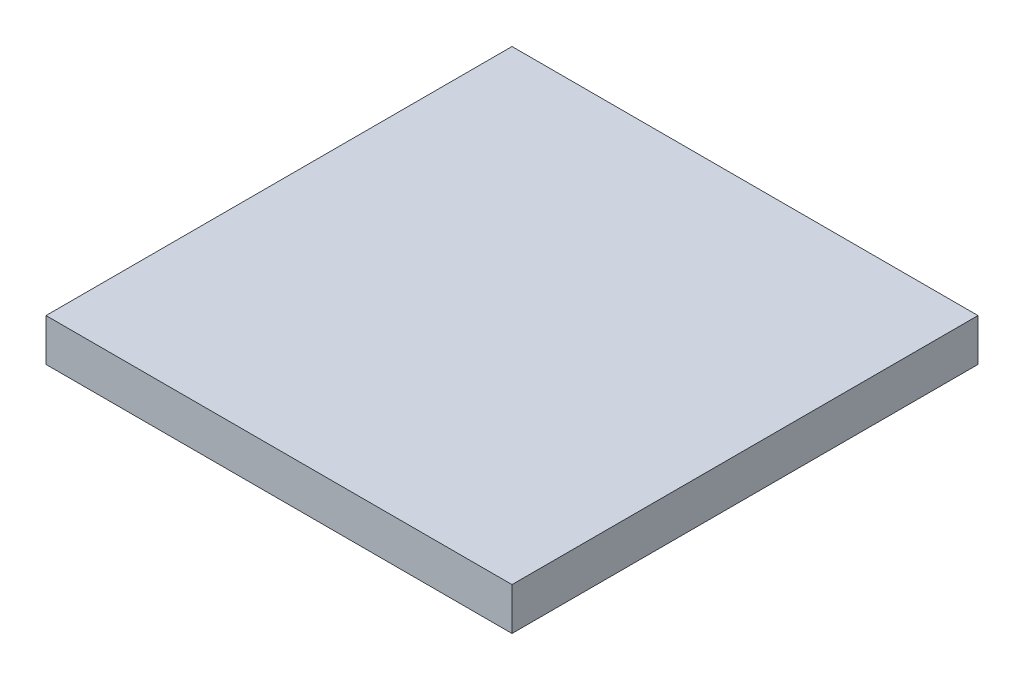
ISO-10303-21;
HEADER;
FILE_DESCRIPTION(('STEP AP214'),'2;1');
FILE_NAME('part.step','',(''),(''),'','','');
FILE_SCHEMA(('AUTOMOTIVE_DESIGN { 1 0 10303 214 1 1 1 1 }'));
ENDSEC;
DATA;
#1=APPLICATION_CONTEXT('core data for automotive mechanical design processes');
#2=APPLICATION_PROTOCOL_DEFINITION('international standard','automotive_design',2000,#1);
#3=PRODUCT_CONTEXT('',#1,'mechanical');
#4=PRODUCT('Part','Part','',(#3));
#5=PRODUCT_RELATED_PRODUCT_CATEGORY('part','',(#4));
#6=PRODUCT_DEFINITION_FORMATION('','',#4);
#7=PRODUCT_DEFINITION_CONTEXT('part definition',#1,'design');
#8=PRODUCT_DEFINITION('design','',#6,#7);
#9=PRODUCT_DEFINITION_SHAPE('','',#8);
#10=(LENGTH_UNIT() NAMED_UNIT(*) SI_UNIT(.MILLI.,.METRE.));
#11=(NAMED_UNIT(*) PLANE_ANGLE_UNIT() SI_UNIT($,.RADIAN.));
#12=(NAMED_UNIT(*) SI_UNIT($,.STERADIAN.) SOLID_ANGLE_UNIT());
#13=UNCERTAINTY_MEASURE_WITH_UNIT(LENGTH_MEASURE(1.E-05),#10,'distance_accuracy_value','');
#14=(GEOMETRIC_REPRESENTATION_CONTEXT(3) GLOBAL_UNCERTAINTY_ASSIGNED_CONTEXT((#13)) GLOBAL_UNIT_ASSIGNED_CONTEXT((#10,
#11,#12)) REPRESENTATION_CONTEXT('',''));
#15=CARTESIAN_POINT('',(0.,0.,0.));
#16=DIRECTION('',(0.,0.,1.));
#17=DIRECTION('',(1.,0.,0.));
#18=AXIS2_PLACEMENT_3D('',#15,#16,#17);
#19=CARTESIAN_POINT('',(55.,5.,0.));
#20=DIRECTION('',(0.,0.,-1.));
#21=DIRECTION('',(-1.,0.,0.));
#22=AXIS2_PLACEMENT_3D('',#19,#20,#21);
#23=PLANE('',#22);
#24=DIRECTION('',(1.,0.,0.));
#25=VECTOR('',#24,1.);
#26=CARTESIAN_POINT('',(55.,0.,0.));
#27=LINE('',#26,#25);
#28=CARTESIAN_POINT('',(0.,0.,0.));
#29=VERTEX_POINT('',#28);
#30=CARTESIAN_POINT('',(55.,0.,0.));
#31=VERTEX_POINT('',#30);
#32=EDGE_CURVE('E111',#29,#31,#27,.T.);
#33=ORIENTED_EDGE('',*,*,#32,.T.);
#34=DIRECTION('',(0.,-1.,0.));
#35=VECTOR('',#34,1.);
#36=CARTESIAN_POINT('',(55.,5.,0.));
#37=LINE('',#36,#35);
#38=CARTESIAN_POINT('',(55.,5.,0.));
#39=VERTEX_POINT('',#38);
#40=EDGE_CURVE('E11',#39,#31,#37,.T.);
#41=ORIENTED_EDGE('',*,*,#40,.F.);
#42=DIRECTION('',(1.,0.,0.));
#43=VECTOR('',#42,1.);
#44=CARTESIAN_POINT('',(55.,5.,0.));
#45=LINE('',#44,#43);
#46=CARTESIAN_POINT('',(0.,5.,0.));
#47=VERTEX_POINT('',#46);
#48=EDGE_CURVE('E95',#47,#39,#45,.T.);
#49=ORIENTED_EDGE('',*,*,#48,.F.);
#50=DIRECTION('',(0.,-1.,0.));
#51=VECTOR('',#50,1.);
#52=CARTESIAN_POINT('',(0.,5.,0.));
#53=LINE('',#52,#51);
#54=EDGE_CURVE('E107',#47,#29,#53,.T.);
#55=ORIENTED_EDGE('',*,*,#54,.T.);
#56=EDGE_LOOP('',(#33,#41,#49,#55));
#57=FACE_BOUND('',#56,.T.);
#58=ADVANCED_FACE('F43',(#57),#23,.F.);
#59=CARTESIAN_POINT('',(55.,5.,-55.));
#60=DIRECTION('',(-1.,0.,0.));
#61=DIRECTION('',(0.,0.,1.));
#62=AXIS2_PLACEMENT_3D('',#59,#60,#61);
#63=PLANE('',#62);
#64=DIRECTION('',(0.,0.,-1.));
#65=VECTOR('',#64,1.);
#66=CARTESIAN_POINT('',(55.,0.,-55.));
#67=LINE('',#66,#65);
#68=CARTESIAN_POINT('',(55.,0.,-55.));
#69=VERTEX_POINT('',#68);
#70=EDGE_CURVE('E100',#31,#69,#67,.T.);
#71=ORIENTED_EDGE('',*,*,#70,.T.);
#72=DIRECTION('',(0.,-1.,0.));
#73=VECTOR('',#72,1.);
#74=CARTESIAN_POINT('',(55.,5.,-55.));
#75=LINE('',#74,#73);
#76=CARTESIAN_POINT('',(55.,5.,-55.));
#77=VERTEX_POINT('',#76);
#78=EDGE_CURVE('E52',#77,#69,#75,.T.);
#79=ORIENTED_EDGE('',*,*,#78,.F.);
#80=DIRECTION('',(0.,0.,-1.));
#81=VECTOR('',#80,1.);
#82=CARTESIAN_POINT('',(55.,5.,-55.));
#83=LINE('',#82,#81);
#84=EDGE_CURVE('E90',#39,#77,#83,.T.);
#85=ORIENTED_EDGE('',*,*,#84,.F.);
#86=ORIENTED_EDGE('',*,*,#40,.T.);
#87=EDGE_LOOP('',(#71,#79,#85,#86));
#88=FACE_BOUND('',#87,.T.);
#89=ADVANCED_FACE('F99',(#88),#63,.F.);
#90=CARTESIAN_POINT('',(0.,5.,-55.));
#91=DIRECTION('',(0.,0.,1.));
#92=DIRECTION('',(1.,0.,0.));
#93=AXIS2_PLACEMENT_3D('',#90,#91,#92);
#94=PLANE('',#93);
#95=DIRECTION('',(-1.,0.,0.));
#96=VECTOR('',#95,1.);
#97=CARTESIAN_POINT('',(0.,0.,-55.));
#98=LINE('',#97,#96);
#99=CARTESIAN_POINT('',(0.,0.,-55.));
#100=VERTEX_POINT('',#99);
#101=EDGE_CURVE('E77',#69,#100,#98,.T.);
#102=ORIENTED_EDGE('',*,*,#101,.T.);
#103=DIRECTION('',(0.,-1.,0.));
#104=VECTOR('',#103,1.);
#105=CARTESIAN_POINT('',(0.,5.,-55.));
#106=LINE('',#105,#104);
#107=CARTESIAN_POINT('',(0.,5.,-55.));
#108=VERTEX_POINT('',#107);
#109=EDGE_CURVE('E102',#108,#100,#106,.T.);
#110=ORIENTED_EDGE('',*,*,#109,.F.);
#111=DIRECTION('',(-1.,0.,0.));
#112=VECTOR('',#111,1.);
#113=CARTESIAN_POINT('',(0.,5.,-55.));
#114=LINE('',#113,#112);
#115=EDGE_CURVE('E93',#77,#108,#114,.T.);
#116=ORIENTED_EDGE('',*,*,#115,.F.);
#117=ORIENTED_EDGE('',*,*,#78,.T.);
#118=EDGE_LOOP('',(#102,#110,#116,#117));
#119=FACE_BOUND('',#118,.T.);
#120=ADVANCED_FACE('F103',(#119),#94,.F.);
#121=CARTESIAN_POINT('',(0.,5.,0.));
#122=DIRECTION('',(1.,0.,0.));
#123=DIRECTION('',(0.,0.,-1.));
#124=AXIS2_PLACEMENT_3D('',#121,#122,#123);
#125=PLANE('',#124);
#126=DIRECTION('',(0.,0.,1.));
#127=VECTOR('',#126,1.);
#128=CARTESIAN_POINT('',(0.,0.,0.));
#129=LINE('',#128,#127);
#130=EDGE_CURVE('E83',#100,#29,#129,.T.);
#131=ORIENTED_EDGE('',*,*,#130,.T.);
#132=ORIENTED_EDGE('',*,*,#54,.F.);
#133=DIRECTION('',(0.,0.,1.));
#134=VECTOR('',#133,1.);
#135=CARTESIAN_POINT('',(0.,5.,0.));
#136=LINE('',#135,#134);
#137=EDGE_CURVE('E60',#108,#47,#136,.T.);
#138=ORIENTED_EDGE('',*,*,#137,.F.);
#139=ORIENTED_EDGE('',*,*,#109,.T.);
#140=EDGE_LOOP('',(#131,#132,#138,#139));
#141=FACE_BOUND('',#140,.T.);
#142=ADVANCED_FACE('F124',(#141),#125,.F.);
#143=CARTESIAN_POINT('',(0.,5.,0.));
#144=DIRECTION('',(0.,-1.,0.));
#145=DIRECTION('',(0.,0.,-1.));
#146=AXIS2_PLACEMENT_3D('',#143,#144,#145);
#147=PLANE('',#146);
#148=ORIENTED_EDGE('',*,*,#48,.T.);
#149=ORIENTED_EDGE('',*,*,#84,.T.);
#150=ORIENTED_EDGE('',*,*,#115,.T.);
#151=ORIENTED_EDGE('',*,*,#137,.T.);
#152=EDGE_LOOP('',(#148,#149,#150,#151));
#153=FACE_BOUND('',#152,.T.);
#154=ADVANCED_FACE('F91',(#153),#147,.F.);
#155=CARTESIAN_POINT('',(0.,0.,0.));
#156=DIRECTION('',(0.,-1.,0.));
#157=DIRECTION('',(0.,0.,-1.));
#158=AXIS2_PLACEMENT_3D('',#155,#156,#157);
#159=PLANE('',#158);
#160=ORIENTED_EDGE('',*,*,#32,.F.);
#161=ORIENTED_EDGE('',*,*,#130,.F.);
#162=ORIENTED_EDGE('',*,*,#101,.F.);
#163=ORIENTED_EDGE('',*,*,#70,.F.);
#164=EDGE_LOOP('',(#160,#161,#162,#163));
#165=FACE_BOUND('',#164,.T.);
#166=ADVANCED_FACE('F127',(#165),#159,.T.);
#167=CLOSED_SHELL('',(#58,#89,#120,#142,#154,#166));
#168=MANIFOLD_SOLID_BREP('B2',#167);
#169=ADVANCED_BREP_SHAPE_REPRESENTATION('',(#18,#168),#14);
#170=SHAPE_DEFINITION_REPRESENTATION(#9,#169);
ENDSEC;
END-ISO-10303-21;
